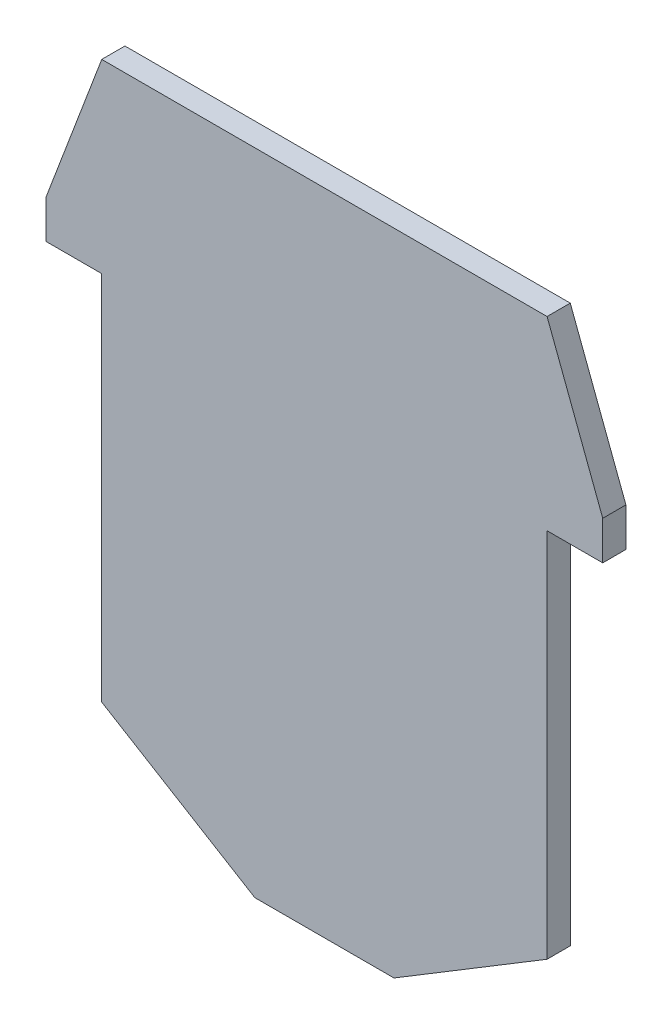
ISO-10303-21;
HEADER;
FILE_DESCRIPTION(('STEP AP214'),'2;1');
FILE_NAME('part.step','',(''),(''),'','','');
FILE_SCHEMA(('AUTOMOTIVE_DESIGN { 1 0 10303 214 1 1 1 1 }'));
ENDSEC;
DATA;
#1=APPLICATION_CONTEXT('core data for automotive mechanical design processes');
#2=APPLICATION_PROTOCOL_DEFINITION('international standard','automotive_design',2000,#1);
#3=PRODUCT_CONTEXT('',#1,'mechanical');
#4=PRODUCT('Part','Part','',(#3));
#5=PRODUCT_RELATED_PRODUCT_CATEGORY('part','',(#4));
#6=PRODUCT_DEFINITION_FORMATION('','',#4);
#7=PRODUCT_DEFINITION_CONTEXT('part definition',#1,'design');
#8=PRODUCT_DEFINITION('design','',#6,#7);
#9=PRODUCT_DEFINITION_SHAPE('','',#8);
#10=(LENGTH_UNIT() NAMED_UNIT(*) SI_UNIT(.MILLI.,.METRE.));
#11=(NAMED_UNIT(*) PLANE_ANGLE_UNIT() SI_UNIT($,.RADIAN.));
#12=(NAMED_UNIT(*) SI_UNIT($,.STERADIAN.) SOLID_ANGLE_UNIT());
#13=UNCERTAINTY_MEASURE_WITH_UNIT(LENGTH_MEASURE(1.E-05),#10,'distance_accuracy_value','');
#14=(GEOMETRIC_REPRESENTATION_CONTEXT(3) GLOBAL_UNCERTAINTY_ASSIGNED_CONTEXT((#13)) GLOBAL_UNIT_ASSIGNED_CONTEXT((#10,
#11,#12)) REPRESENTATION_CONTEXT('',''));
#15=CARTESIAN_POINT('',(0.,0.,0.));
#16=DIRECTION('',(0.,0.,1.));
#17=DIRECTION('',(1.,0.,0.));
#18=AXIS2_PLACEMENT_3D('',#15,#16,#17);
#19=CARTESIAN_POINT('',(0.,1.67664670658683,5.));
#20=DIRECTION('',(0.,1.,0.));
#21=DIRECTION('',(0.,0.,1.));
#22=AXIS2_PLACEMENT_3D('',#19,#20,#21);
#23=PLANE('',#22);
#24=DIRECTION('',(1.,0.,0.));
#25=VECTOR('',#24,1.);
#26=CARTESIAN_POINT('',(0.,1.67664670658683,0.));
#27=LINE('',#26,#25);
#28=CARTESIAN_POINT('',(-34.4910179640718,1.67664670658683,0.));
#29=VERTEX_POINT('',#28);
#30=CARTESIAN_POINT('',(-22.4910179640718,1.67664670658683,0.));
#31=VERTEX_POINT('',#30);
#32=EDGE_CURVE('E160',#29,#31,#27,.T.);
#33=ORIENTED_EDGE('',*,*,#32,.T.);
#34=DIRECTION('',(0.,0.,-1.));
#35=VECTOR('',#34,1.);
#36=CARTESIAN_POINT('',(-22.4910179640718,1.67664670658683,5.));
#37=LINE('',#36,#35);
#38=CARTESIAN_POINT('',(-22.4910179640718,1.67664670658683,5.));
#39=VERTEX_POINT('',#38);
#40=EDGE_CURVE('E11',#39,#31,#37,.T.);
#41=ORIENTED_EDGE('',*,*,#40,.F.);
#42=DIRECTION('',(1.,0.,0.));
#43=VECTOR('',#42,1.);
#44=CARTESIAN_POINT('',(0.,1.67664670658683,5.));
#45=LINE('',#44,#43);
#46=CARTESIAN_POINT('',(-34.4910179640718,1.67664670658683,5.));
#47=VERTEX_POINT('',#46);
#48=EDGE_CURVE('E188',#47,#39,#45,.T.);
#49=ORIENTED_EDGE('',*,*,#48,.F.);
#50=DIRECTION('',(0.,0.,-1.));
#51=VECTOR('',#50,1.);
#52=CARTESIAN_POINT('',(-34.4910179640718,1.67664670658683,5.));
#53=LINE('',#52,#51);
#54=EDGE_CURVE('E159',#47,#29,#53,.T.);
#55=ORIENTED_EDGE('',*,*,#54,.T.);
#56=EDGE_LOOP('',(#33,#41,#49,#55));
#57=FACE_BOUND('',#56,.T.);
#58=ADVANCED_FACE('F38',(#57),#23,.F.);
#59=CARTESIAN_POINT('',(-22.4910179640718,0.,5.));
#60=DIRECTION('',(1.,0.,0.));
#61=DIRECTION('',(0.,1.,0.));
#62=AXIS2_PLACEMENT_3D('',#59,#60,#61);
#63=PLANE('',#62);
#64=DIRECTION('',(0.,-1.,0.));
#65=VECTOR('',#64,1.);
#66=CARTESIAN_POINT('',(-22.4910179640718,0.,0.));
#67=LINE('',#66,#65);
#68=CARTESIAN_POINT('',(-22.4910179640718,-78.3233532934132,0.));
#69=VERTEX_POINT('',#68);
#70=EDGE_CURVE('E163',#31,#69,#67,.T.);
#71=ORIENTED_EDGE('',*,*,#70,.T.);
#72=DIRECTION('',(0.,0.,-1.));
#73=VECTOR('',#72,1.);
#74=CARTESIAN_POINT('',(-22.4910179640718,-78.3233532934132,5.));
#75=LINE('',#74,#73);
#76=CARTESIAN_POINT('',(-22.4910179640718,-78.3233532934132,5.));
#77=VERTEX_POINT('',#76);
#78=EDGE_CURVE('E46',#77,#69,#75,.T.);
#79=ORIENTED_EDGE('',*,*,#78,.F.);
#80=DIRECTION('',(0.,-1.,0.));
#81=VECTOR('',#80,1.);
#82=CARTESIAN_POINT('',(-22.4910179640718,0.,5.));
#83=LINE('',#82,#81);
#84=EDGE_CURVE('E108',#39,#77,#83,.T.);
#85=ORIENTED_EDGE('',*,*,#84,.F.);
#86=ORIENTED_EDGE('',*,*,#40,.T.);
#87=EDGE_LOOP('',(#71,#79,#85,#86));
#88=FACE_BOUND('',#87,.T.);
#89=ADVANCED_FACE('F257',(#88),#63,.F.);
#90=CARTESIAN_POINT('',(-40.7587779444469,-67.2519836083374,5.));
#91=DIRECTION('',(0.518301716093345,0.855197831554018,0.));
#92=DIRECTION('',(-0.855197831554018,0.518301716093345,0.));
#93=AXIS2_PLACEMENT_3D('',#90,#91,#92);
#94=PLANE('',#93);
#95=DIRECTION('',(0.855197831554018,-0.518301716093345,0.));
#96=VECTOR('',#95,1.);
#97=CARTESIAN_POINT('',(-40.7587779444469,-67.2519836083374,0.));
#98=LINE('',#97,#96);
#99=CARTESIAN_POINT('',(10.5089820359282,-98.3233532934132,0.));
#100=VERTEX_POINT('',#99);
#101=EDGE_CURVE('E165',#69,#100,#98,.T.);
#102=ORIENTED_EDGE('',*,*,#101,.T.);
#103=DIRECTION('',(0.,0.,-1.));
#104=VECTOR('',#103,1.);
#105=CARTESIAN_POINT('',(10.5089820359282,-98.3233532934132,5.));
#106=LINE('',#105,#104);
#107=CARTESIAN_POINT('',(10.5089820359282,-98.3233532934132,5.));
#108=VERTEX_POINT('',#107);
#109=EDGE_CURVE('E202',#108,#100,#106,.T.);
#110=ORIENTED_EDGE('',*,*,#109,.F.);
#111=DIRECTION('',(0.855197831554018,-0.518301716093345,0.));
#112=VECTOR('',#111,1.);
#113=CARTESIAN_POINT('',(-40.7587779444469,-67.2519836083374,5.));
#114=LINE('',#113,#112);
#115=EDGE_CURVE('E210',#77,#108,#114,.T.);
#116=ORIENTED_EDGE('',*,*,#115,.F.);
#117=ORIENTED_EDGE('',*,*,#78,.T.);
#118=EDGE_LOOP('',(#102,#110,#116,#117));
#119=FACE_BOUND('',#118,.T.);
#120=ADVANCED_FACE('F208',(#119),#94,.F.);
#121=CARTESIAN_POINT('',(0.,-98.3233532934132,5.));
#122=DIRECTION('',(0.,1.,0.));
#123=DIRECTION('',(0.,0.,1.));
#124=AXIS2_PLACEMENT_3D('',#121,#122,#123);
#125=PLANE('',#124);
#126=DIRECTION('',(1.,0.,0.));
#127=VECTOR('',#126,1.);
#128=CARTESIAN_POINT('',(0.,-98.3233532934132,0.));
#129=LINE('',#128,#127);
#130=CARTESIAN_POINT('',(40.5089820359281,-98.3233532934132,0.));
#131=VERTEX_POINT('',#130);
#132=EDGE_CURVE('E167',#100,#131,#129,.T.);
#133=ORIENTED_EDGE('',*,*,#132,.T.);
#134=DIRECTION('',(0.,0.,-1.));
#135=VECTOR('',#134,1.);
#136=CARTESIAN_POINT('',(40.5089820359281,-98.3233532934132,5.));
#137=LINE('',#136,#135);
#138=CARTESIAN_POINT('',(40.5089820359281,-98.3233532934132,5.));
#139=VERTEX_POINT('',#138);
#140=EDGE_CURVE('E200',#139,#131,#137,.T.);
#141=ORIENTED_EDGE('',*,*,#140,.F.);
#142=DIRECTION('',(1.,0.,0.));
#143=VECTOR('',#142,1.);
#144=CARTESIAN_POINT('',(0.,-98.3233532934132,5.));
#145=LINE('',#144,#143);
#146=EDGE_CURVE('E221',#108,#139,#145,.T.);
#147=ORIENTED_EDGE('',*,*,#146,.F.);
#148=ORIENTED_EDGE('',*,*,#109,.T.);
#149=EDGE_LOOP('',(#133,#141,#147,#148));
#150=FACE_BOUND('',#149,.T.);
#151=ADVANCED_FACE('F218',(#150),#125,.F.);
#152=CARTESIAN_POINT('',(54.464073867041,-89.8657218806175,5.));
#153=DIRECTION('',(0.518301716093345,-0.855197831554018,0.));
#154=DIRECTION('',(0.855197831554018,0.518301716093345,0.));
#155=AXIS2_PLACEMENT_3D('',#152,#153,#154);
#156=PLANE('',#155);
#157=DIRECTION('',(-0.855197831554018,-0.518301716093345,0.));
#158=VECTOR('',#157,1.);
#159=CARTESIAN_POINT('',(54.464073867041,-89.8657218806175,0.));
#160=LINE('',#159,#158);
#161=CARTESIAN_POINT('',(73.5089820359282,-78.3233532934132,0.));
#162=VERTEX_POINT('',#161);
#163=EDGE_CURVE('E170',#162,#131,#160,.T.);
#164=ORIENTED_EDGE('',*,*,#163,.F.);
#165=DIRECTION('',(0.,0.,-1.));
#166=VECTOR('',#165,1.);
#167=CARTESIAN_POINT('',(73.5089820359282,-78.3233532934132,5.));
#168=LINE('',#167,#166);
#169=CARTESIAN_POINT('',(73.5089820359282,-78.3233532934132,5.));
#170=VERTEX_POINT('',#169);
#171=EDGE_CURVE('E198',#170,#162,#168,.T.);
#172=ORIENTED_EDGE('',*,*,#171,.F.);
#173=DIRECTION('',(-0.855197831554018,-0.518301716093345,0.));
#174=VECTOR('',#173,1.);
#175=CARTESIAN_POINT('',(54.464073867041,-89.8657218806175,5.));
#176=LINE('',#175,#174);
#177=EDGE_CURVE('E223',#170,#139,#176,.T.);
#178=ORIENTED_EDGE('',*,*,#177,.T.);
#179=ORIENTED_EDGE('',*,*,#140,.T.);
#180=EDGE_LOOP('',(#164,#172,#178,#179));
#181=FACE_BOUND('',#180,.T.);
#182=ADVANCED_FACE('F268',(#181),#156,.T.);
#183=CARTESIAN_POINT('',(73.5089820359282,0.,5.));
#184=DIRECTION('',(1.,0.,0.));
#185=DIRECTION('',(0.,1.,0.));
#186=AXIS2_PLACEMENT_3D('',#183,#184,#185);
#187=PLANE('',#186);
#188=DIRECTION('',(0.,-1.,0.));
#189=VECTOR('',#188,1.);
#190=CARTESIAN_POINT('',(73.5089820359282,0.,0.));
#191=LINE('',#190,#189);
#192=CARTESIAN_POINT('',(73.5089820359282,1.67664670658683,0.));
#193=VERTEX_POINT('',#192);
#194=EDGE_CURVE('E173',#193,#162,#191,.T.);
#195=ORIENTED_EDGE('',*,*,#194,.F.);
#196=DIRECTION('',(0.,0.,-1.));
#197=VECTOR('',#196,1.);
#198=CARTESIAN_POINT('',(73.5089820359282,1.67664670658683,5.));
#199=LINE('',#198,#197);
#200=CARTESIAN_POINT('',(73.5089820359282,1.67664670658683,5.));
#201=VERTEX_POINT('',#200);
#202=EDGE_CURVE('E196',#201,#193,#199,.T.);
#203=ORIENTED_EDGE('',*,*,#202,.F.);
#204=DIRECTION('',(0.,-1.,0.));
#205=VECTOR('',#204,1.);
#206=CARTESIAN_POINT('',(73.5089820359282,0.,5.));
#207=LINE('',#206,#205);
#208=EDGE_CURVE('E225',#201,#170,#207,.T.);
#209=ORIENTED_EDGE('',*,*,#208,.T.);
#210=ORIENTED_EDGE('',*,*,#171,.T.);
#211=EDGE_LOOP('',(#195,#203,#209,#210));
#212=FACE_BOUND('',#211,.T.);
#213=ADVANCED_FACE('F271',(#212),#187,.T.);
#214=CARTESIAN_POINT('',(0.,1.67664670658683,5.));
#215=DIRECTION('',(0.,1.,0.));
#216=DIRECTION('',(0.,0.,1.));
#217=AXIS2_PLACEMENT_3D('',#214,#215,#216);
#218=PLANE('',#217);
#219=DIRECTION('',(1.,0.,0.));
#220=VECTOR('',#219,1.);
#221=CARTESIAN_POINT('',(0.,1.67664670658683,0.));
#222=LINE('',#221,#220);
#223=CARTESIAN_POINT('',(85.5089820359281,1.67664670658683,0.));
#224=VERTEX_POINT('',#223);
#225=EDGE_CURVE('E176',#193,#224,#222,.T.);
#226=ORIENTED_EDGE('',*,*,#225,.T.);
#227=DIRECTION('',(0.,0.,-1.));
#228=VECTOR('',#227,1.);
#229=CARTESIAN_POINT('',(85.5089820359281,1.67664670658683,5.));
#230=LINE('',#229,#228);
#231=CARTESIAN_POINT('',(85.5089820359281,1.67664670658683,5.));
#232=VERTEX_POINT('',#231);
#233=EDGE_CURVE('E194',#232,#224,#230,.T.);
#234=ORIENTED_EDGE('',*,*,#233,.F.);
#235=DIRECTION('',(1.,0.,0.));
#236=VECTOR('',#235,1.);
#237=CARTESIAN_POINT('',(0.,1.67664670658683,5.));
#238=LINE('',#237,#236);
#239=EDGE_CURVE('E232',#201,#232,#238,.T.);
#240=ORIENTED_EDGE('',*,*,#239,.F.);
#241=ORIENTED_EDGE('',*,*,#202,.T.);
#242=EDGE_LOOP('',(#226,#234,#240,#241));
#243=FACE_BOUND('',#242,.T.);
#244=ADVANCED_FACE('F275',(#243),#218,.F.);
#245=CARTESIAN_POINT('',(85.5089820359281,0.,5.));
#246=DIRECTION('',(1.,0.,0.));
#247=DIRECTION('',(0.,1.,0.));
#248=AXIS2_PLACEMENT_3D('',#245,#246,#247);
#249=PLANE('',#248);
#250=DIRECTION('',(0.,-1.,0.));
#251=VECTOR('',#250,1.);
#252=CARTESIAN_POINT('',(85.5089820359281,0.,0.));
#253=LINE('',#252,#251);
#254=CARTESIAN_POINT('',(85.5089820359281,10.0029558712514,0.));
#255=VERTEX_POINT('',#254);
#256=EDGE_CURVE('E179',#255,#224,#253,.T.);
#257=ORIENTED_EDGE('',*,*,#256,.F.);
#258=DIRECTION('',(0.,0.,-1.));
#259=VECTOR('',#258,1.);
#260=CARTESIAN_POINT('',(85.5089820359281,10.0029558712514,5.));
#261=LINE('',#260,#259);
#262=CARTESIAN_POINT('',(85.5089820359281,10.0029558712514,5.));
#263=VERTEX_POINT('',#262);
#264=EDGE_CURVE('E192',#263,#255,#261,.T.);
#265=ORIENTED_EDGE('',*,*,#264,.F.);
#266=DIRECTION('',(0.,-1.,0.));
#267=VECTOR('',#266,1.);
#268=CARTESIAN_POINT('',(85.5089820359281,0.,5.));
#269=LINE('',#268,#267);
#270=EDGE_CURVE('E154',#263,#232,#269,.T.);
#271=ORIENTED_EDGE('',*,*,#270,.T.);
#272=ORIENTED_EDGE('',*,*,#233,.T.);
#273=EDGE_LOOP('',(#257,#265,#271,#272));
#274=FACE_BOUND('',#273,.T.);
#275=ADVANCED_FACE('F236',(#274),#249,.T.);
#276=CARTESIAN_POINT('',(78.0899106572876,29.5854036322802,5.));
#277=DIRECTION('',(0.935136070414817,0.354288766134538,0.));
#278=DIRECTION('',(-0.354288766134538,0.935136070414817,0.));
#279=AXIS2_PLACEMENT_3D('',#276,#277,#278);
#280=PLANE('',#279);
#281=DIRECTION('',(0.354288766134538,-0.935136070414817,0.));
#282=VECTOR('',#281,1.);
#283=CARTESIAN_POINT('',(78.0899106572876,29.5854036322802,0.));
#284=LINE('',#283,#282);
#285=CARTESIAN_POINT('',(73.5089820359282,41.6766467065868,0.));
#286=VERTEX_POINT('',#285);
#287=EDGE_CURVE('E182',#286,#255,#284,.T.);
#288=ORIENTED_EDGE('',*,*,#287,.F.);
#289=DIRECTION('',(0.,0.,-1.));
#290=VECTOR('',#289,1.);
#291=CARTESIAN_POINT('',(73.5089820359282,41.6766467065868,5.));
#292=LINE('',#291,#290);
#293=CARTESIAN_POINT('',(73.5089820359282,41.6766467065868,5.));
#294=VERTEX_POINT('',#293);
#295=EDGE_CURVE('E142',#294,#286,#292,.T.);
#296=ORIENTED_EDGE('',*,*,#295,.F.);
#297=DIRECTION('',(0.354288766134538,-0.935136070414817,0.));
#298=VECTOR('',#297,1.);
#299=CARTESIAN_POINT('',(78.0899106572876,29.5854036322802,5.));
#300=LINE('',#299,#298);
#301=EDGE_CURVE('E152',#294,#263,#300,.T.);
#302=ORIENTED_EDGE('',*,*,#301,.T.);
#303=ORIENTED_EDGE('',*,*,#264,.T.);
#304=EDGE_LOOP('',(#288,#296,#302,#303));
#305=FACE_BOUND('',#304,.T.);
#306=ADVANCED_FACE('F242',(#305),#280,.T.);
#307=CARTESIAN_POINT('',(0.,41.6766467065868,5.));
#308=DIRECTION('',(0.,1.,0.));
#309=DIRECTION('',(-1.,0.,0.));
#310=AXIS2_PLACEMENT_3D('',#307,#308,#309);
#311=PLANE('',#310);
#312=DIRECTION('',(1.,0.,0.));
#313=VECTOR('',#312,1.);
#314=CARTESIAN_POINT('',(0.,41.6766467065868,0.));
#315=LINE('',#314,#313);
#316=CARTESIAN_POINT('',(-22.4910179640718,41.6766467065868,0.));
#317=VERTEX_POINT('',#316);
#318=EDGE_CURVE('E141',#317,#286,#315,.T.);
#319=ORIENTED_EDGE('',*,*,#318,.F.);
#320=DIRECTION('',(0.,0.,-1.));
#321=VECTOR('',#320,1.);
#322=CARTESIAN_POINT('',(-22.4910179640718,41.6766467065868,5.));
#323=LINE('',#322,#321);
#324=CARTESIAN_POINT('',(-22.4910179640718,41.6766467065868,5.));
#325=VERTEX_POINT('',#324);
#326=EDGE_CURVE('E135',#325,#317,#323,.T.);
#327=ORIENTED_EDGE('',*,*,#326,.F.);
#328=DIRECTION('',(1.,0.,0.));
#329=VECTOR('',#328,1.);
#330=CARTESIAN_POINT('',(0.,41.6766467065868,5.));
#331=LINE('',#330,#329);
#332=EDGE_CURVE('E139',#325,#294,#331,.T.);
#333=ORIENTED_EDGE('',*,*,#332,.T.);
#334=ORIENTED_EDGE('',*,*,#295,.T.);
#335=EDGE_LOOP('',(#319,#327,#333,#334));
#336=FACE_BOUND('',#335,.T.);
#337=ADVANCED_FACE('F137',(#336),#311,.T.);
#338=CARTESIAN_POINT('',(-33.4757484655141,12.6827335555735,5.));
#339=DIRECTION('',(0.935136070414817,-0.354288766134539,0.));
#340=DIRECTION('',(0.354288766134539,0.935136070414817,0.));
#341=AXIS2_PLACEMENT_3D('',#338,#339,#340);
#342=PLANE('',#341);
#343=DIRECTION('',(-0.354288766134539,-0.935136070414817,0.));
#344=VECTOR('',#343,1.);
#345=CARTESIAN_POINT('',(-33.4757484655141,12.6827335555735,0.));
#346=LINE('',#345,#344);
#347=CARTESIAN_POINT('',(-34.4910179640719,10.0029558712515,0.));
#348=VERTEX_POINT('',#347);
#349=EDGE_CURVE('E94',#317,#348,#346,.T.);
#350=ORIENTED_EDGE('',*,*,#349,.T.);
#351=DIRECTION('',(0.,0.,-1.));
#352=VECTOR('',#351,1.);
#353=CARTESIAN_POINT('',(-34.4910179640719,10.0029558712515,5.));
#354=LINE('',#353,#352);
#355=CARTESIAN_POINT('',(-34.4910179640719,10.0029558712515,5.));
#356=VERTEX_POINT('',#355);
#357=EDGE_CURVE('E143',#356,#348,#354,.T.);
#358=ORIENTED_EDGE('',*,*,#357,.F.);
#359=DIRECTION('',(-0.354288766134539,-0.935136070414817,0.));
#360=VECTOR('',#359,1.);
#361=CARTESIAN_POINT('',(-33.4757484655141,12.6827335555735,5.));
#362=LINE('',#361,#360);
#363=EDGE_CURVE('E145',#325,#356,#362,.T.);
#364=ORIENTED_EDGE('',*,*,#363,.F.);
#365=ORIENTED_EDGE('',*,*,#326,.T.);
#366=EDGE_LOOP('',(#350,#358,#364,#365));
#367=FACE_BOUND('',#366,.T.);
#368=ADVANCED_FACE('F146',(#367),#342,.F.);
#369=CARTESIAN_POINT('',(-34.4910179640718,0.,5.));
#370=DIRECTION('',(1.,0.,0.));
#371=DIRECTION('',(0.,1.,0.));
#372=AXIS2_PLACEMENT_3D('',#369,#370,#371);
#373=PLANE('',#372);
#374=DIRECTION('',(0.,-1.,0.));
#375=VECTOR('',#374,1.);
#376=CARTESIAN_POINT('',(-34.4910179640718,0.,0.));
#377=LINE('',#376,#375);
#378=EDGE_CURVE('E100',#348,#29,#377,.T.);
#379=ORIENTED_EDGE('',*,*,#378,.T.);
#380=ORIENTED_EDGE('',*,*,#54,.F.);
#381=DIRECTION('',(0.,-1.,0.));
#382=VECTOR('',#381,1.);
#383=CARTESIAN_POINT('',(-34.4910179640718,0.,5.));
#384=LINE('',#383,#382);
#385=EDGE_CURVE('E54',#356,#47,#384,.T.);
#386=ORIENTED_EDGE('',*,*,#385,.F.);
#387=ORIENTED_EDGE('',*,*,#357,.T.);
#388=EDGE_LOOP('',(#379,#380,#386,#387));
#389=FACE_BOUND('',#388,.T.);
#390=ADVANCED_FACE('F246',(#389),#373,.F.);
#391=CARTESIAN_POINT('',(0.,0.,5.));
#392=DIRECTION('',(0.,0.,1.));
#393=DIRECTION('',(1.,0.,0.));
#394=AXIS2_PLACEMENT_3D('',#391,#392,#393);
#395=PLANE('',#394);
#396=ORIENTED_EDGE('',*,*,#48,.T.);
#397=ORIENTED_EDGE('',*,*,#84,.T.);
#398=ORIENTED_EDGE('',*,*,#115,.T.);
#399=ORIENTED_EDGE('',*,*,#146,.T.);
#400=ORIENTED_EDGE('',*,*,#177,.F.);
#401=ORIENTED_EDGE('',*,*,#208,.F.);
#402=ORIENTED_EDGE('',*,*,#239,.T.);
#403=ORIENTED_EDGE('',*,*,#270,.F.);
#404=ORIENTED_EDGE('',*,*,#301,.F.);
#405=ORIENTED_EDGE('',*,*,#332,.F.);
#406=ORIENTED_EDGE('',*,*,#363,.T.);
#407=ORIENTED_EDGE('',*,*,#385,.T.);
#408=EDGE_LOOP('',(#396,#397,#398,#399,#400,#401,#402,#403,#404,#405,#406,#407));
#409=FACE_BOUND('',#408,.T.);
#410=ADVANCED_FACE('F149',(#409),#395,.T.);
#411=CARTESIAN_POINT('',(0.,0.,0.));
#412=DIRECTION('',(0.,0.,1.));
#413=DIRECTION('',(1.,0.,0.));
#414=AXIS2_PLACEMENT_3D('',#411,#412,#413);
#415=PLANE('',#414);
#416=ORIENTED_EDGE('',*,*,#32,.F.);
#417=ORIENTED_EDGE('',*,*,#378,.F.);
#418=ORIENTED_EDGE('',*,*,#349,.F.);
#419=ORIENTED_EDGE('',*,*,#318,.T.);
#420=ORIENTED_EDGE('',*,*,#287,.T.);
#421=ORIENTED_EDGE('',*,*,#256,.T.);
#422=ORIENTED_EDGE('',*,*,#225,.F.);
#423=ORIENTED_EDGE('',*,*,#194,.T.);
#424=ORIENTED_EDGE('',*,*,#163,.T.);
#425=ORIENTED_EDGE('',*,*,#132,.F.);
#426=ORIENTED_EDGE('',*,*,#101,.F.);
#427=ORIENTED_EDGE('',*,*,#70,.F.);
#428=EDGE_LOOP('',(#416,#417,#418,#419,#420,#421,#422,#423,#424,#425,#426,#427));
#429=FACE_BOUND('',#428,.T.);
#430=ADVANCED_FACE('F214',(#429),#415,.F.);
#431=CLOSED_SHELL('',(#58,#89,#120,#151,#182,#213,#244,#275,#306,#337,#368,#390,#410,#430));
#432=MANIFOLD_SOLID_BREP('B2',#431);
#433=ADVANCED_BREP_SHAPE_REPRESENTATION('',(#18,#432),#14);
#434=SHAPE_DEFINITION_REPRESENTATION(#9,#433);
ENDSEC;
END-ISO-10303-21;
